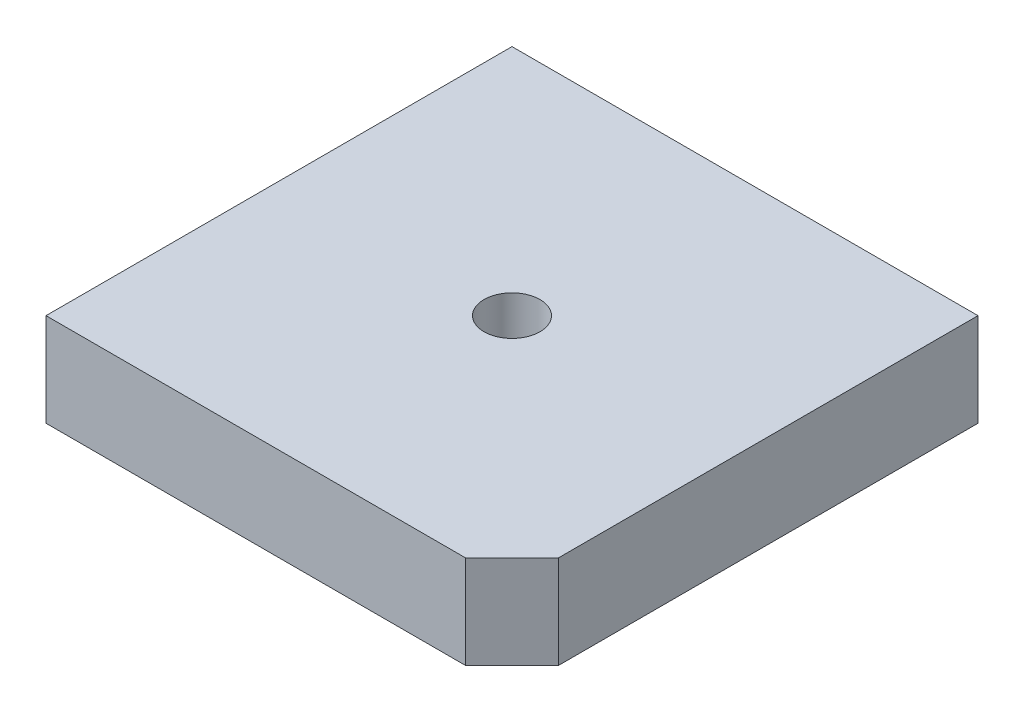
ISO-10303-21;
HEADER;
FILE_DESCRIPTION(('STEP AP214'),'2;1');
FILE_NAME('part.step','',(''),(''),'','','');
FILE_SCHEMA(('AUTOMOTIVE_DESIGN { 1 0 10303 214 1 1 1 1 }'));
ENDSEC;
DATA;
#1=APPLICATION_CONTEXT('core data for automotive mechanical design processes');
#2=APPLICATION_PROTOCOL_DEFINITION('international standard','automotive_design',2000,#1);
#3=PRODUCT_CONTEXT('',#1,'mechanical');
#4=PRODUCT('Part','Part','',(#3));
#5=PRODUCT_RELATED_PRODUCT_CATEGORY('part','',(#4));
#6=PRODUCT_DEFINITION_FORMATION('','',#4);
#7=PRODUCT_DEFINITION_CONTEXT('part definition',#1,'design');
#8=PRODUCT_DEFINITION('design','',#6,#7);
#9=PRODUCT_DEFINITION_SHAPE('','',#8);
#10=(LENGTH_UNIT() NAMED_UNIT(*) SI_UNIT(.MILLI.,.METRE.));
#11=(NAMED_UNIT(*) PLANE_ANGLE_UNIT() SI_UNIT($,.RADIAN.));
#12=(NAMED_UNIT(*) SI_UNIT($,.STERADIAN.) SOLID_ANGLE_UNIT());
#13=UNCERTAINTY_MEASURE_WITH_UNIT(LENGTH_MEASURE(1.E-05),#10,'distance_accuracy_value','');
#14=(GEOMETRIC_REPRESENTATION_CONTEXT(3) GLOBAL_UNCERTAINTY_ASSIGNED_CONTEXT((#13)) GLOBAL_UNIT_ASSIGNED_CONTEXT((#10,
#11,#12)) REPRESENTATION_CONTEXT('',''));
#15=CARTESIAN_POINT('',(0.,0.,0.));
#16=DIRECTION('',(0.,0.,1.));
#17=DIRECTION('',(1.,0.,0.));
#18=AXIS2_PLACEMENT_3D('',#15,#16,#17);
#19=CARTESIAN_POINT('',(-1275.,600.,50.));
#20=DIRECTION('',(0.,1.,0.));
#21=DIRECTION('',(0.,0.,1.));
#22=AXIS2_PLACEMENT_3D('',#19,#20,#21);
#23=PLANE('',#22);
#24=CARTESIAN_POINT('',(1225.,600.,875.));
#25=DIRECTION('',(0.,1.,0.));
#26=DIRECTION('',(0.,0.,1.));
#27=AXIS2_PLACEMENT_3D('',#24,#25,#26);
#28=CIRCLE('',#27,6.00000000000012);
#29=CARTESIAN_POINT('',(1225.,600.,881.));
#30=VERTEX_POINT('',#29);
#31=EDGE_CURVE('E18',#30,#30,#28,.T.);
#32=ORIENTED_EDGE('',*,*,#31,.T.);
#33=EDGE_LOOP('',(#32));
#34=FACE_BOUND('',#33,.T.);
#35=DIRECTION('',(1.,0.,0.));
#36=VECTOR('',#35,1.);
#37=CARTESIAN_POINT('',(1175.,600.,925.));
#38=LINE('',#37,#36);
#39=CARTESIAN_POINT('',(1175.,600.,925.));
#40=VERTEX_POINT('',#39);
#41=CARTESIAN_POINT('',(1265.,600.,925.));
#42=VERTEX_POINT('',#41);
#43=EDGE_CURVE('E89',#40,#42,#38,.T.);
#44=ORIENTED_EDGE('',*,*,#43,.F.);
#45=DIRECTION('',(0.,0.,1.));
#46=VECTOR('',#45,1.);
#47=CARTESIAN_POINT('',(1175.,600.,825.));
#48=LINE('',#47,#46);
#49=CARTESIAN_POINT('',(1175.,600.,825.));
#50=VERTEX_POINT('',#49);
#51=EDGE_CURVE('E59',#50,#40,#48,.T.);
#52=ORIENTED_EDGE('',*,*,#51,.F.);
#53=DIRECTION('',(-1.,0.,0.));
#54=VECTOR('',#53,1.);
#55=CARTESIAN_POINT('',(1275.,600.,825.));
#56=LINE('',#55,#54);
#57=CARTESIAN_POINT('',(1275.,600.,825.));
#58=VERTEX_POINT('',#57);
#59=EDGE_CURVE('E61',#58,#50,#56,.T.);
#60=ORIENTED_EDGE('',*,*,#59,.F.);
#61=DIRECTION('',(0.,0.,-1.));
#62=VECTOR('',#61,1.);
#63=CARTESIAN_POINT('',(1275.,600.,915.));
#64=LINE('',#63,#62);
#65=CARTESIAN_POINT('',(1275.,600.,915.));
#66=VERTEX_POINT('',#65);
#67=EDGE_CURVE('E63',#66,#58,#64,.T.);
#68=ORIENTED_EDGE('',*,*,#67,.F.);
#69=DIRECTION('',(0.707106781186544,0.,-0.707106781186551));
#70=VECTOR('',#69,1.);
#71=CARTESIAN_POINT('',(1265.,600.,925.));
#72=LINE('',#71,#70);
#73=EDGE_CURVE('E91',#42,#66,#72,.T.);
#74=ORIENTED_EDGE('',*,*,#73,.F.);
#75=EDGE_LOOP('',(#44,#52,#60,#68,#74));
#76=FACE_BOUND('',#75,.T.);
#77=ADVANCED_FACE('F15',(#34,#76),#23,.F.);
#78=CARTESIAN_POINT('',(1275.,600.,915.));
#79=DIRECTION('',(1.,0.,0.));
#80=DIRECTION('',(0.,0.,-1.));
#81=AXIS2_PLACEMENT_3D('',#78,#79,#80);
#82=PLANE('',#81);
#83=ORIENTED_EDGE('',*,*,#67,.T.);
#84=DIRECTION('',(0.,1.,0.));
#85=VECTOR('',#84,1.);
#86=CARTESIAN_POINT('',(1275.,600.,825.));
#87=LINE('',#86,#85);
#88=CARTESIAN_POINT('',(1275.,620.,825.));
#89=VERTEX_POINT('',#88);
#90=EDGE_CURVE('E68',#89,#58,#87,.F.);
#91=ORIENTED_EDGE('',*,*,#90,.F.);
#92=DIRECTION('',(0.,0.,1.));
#93=VECTOR('',#92,1.);
#94=CARTESIAN_POINT('',(1275.,620.,0.));
#95=LINE('',#94,#93);
#96=CARTESIAN_POINT('',(1275.,620.,915.));
#97=VERTEX_POINT('',#96);
#98=EDGE_CURVE('E95',#97,#89,#95,.F.);
#99=ORIENTED_EDGE('',*,*,#98,.F.);
#100=DIRECTION('',(0.,1.,0.));
#101=VECTOR('',#100,1.);
#102=CARTESIAN_POINT('',(1275.,600.,915.));
#103=LINE('',#102,#101);
#104=EDGE_CURVE('E74',#66,#97,#103,.T.);
#105=ORIENTED_EDGE('',*,*,#104,.F.);
#106=EDGE_LOOP('',(#83,#91,#99,#105));
#107=FACE_BOUND('',#106,.T.);
#108=ADVANCED_FACE('F71',(#107),#82,.T.);
#109=CARTESIAN_POINT('',(1275.,600.,825.));
#110=DIRECTION('',(0.,0.,-1.));
#111=DIRECTION('',(-1.,0.,0.));
#112=AXIS2_PLACEMENT_3D('',#109,#110,#111);
#113=PLANE('',#112);
#114=DIRECTION('',(1.,0.,0.));
#115=VECTOR('',#114,1.);
#116=CARTESIAN_POINT('',(0.,620.,825.));
#117=LINE('',#116,#115);
#118=CARTESIAN_POINT('',(1175.,620.,825.));
#119=VERTEX_POINT('',#118);
#120=EDGE_CURVE('E79',#89,#119,#117,.F.);
#121=ORIENTED_EDGE('',*,*,#120,.F.);
#122=ORIENTED_EDGE('',*,*,#90,.T.);
#123=ORIENTED_EDGE('',*,*,#59,.T.);
#124=DIRECTION('',(0.,1.,0.));
#125=VECTOR('',#124,1.);
#126=CARTESIAN_POINT('',(1175.,600.,825.));
#127=LINE('',#126,#125);
#128=EDGE_CURVE('E82',#119,#50,#127,.F.);
#129=ORIENTED_EDGE('',*,*,#128,.F.);
#130=EDGE_LOOP('',(#121,#122,#123,#129));
#131=FACE_BOUND('',#130,.T.);
#132=ADVANCED_FACE('F77',(#131),#113,.T.);
#133=CARTESIAN_POINT('',(1175.,600.,825.));
#134=DIRECTION('',(-1.,0.,0.));
#135=DIRECTION('',(0.,0.,1.));
#136=AXIS2_PLACEMENT_3D('',#133,#134,#135);
#137=PLANE('',#136);
#138=DIRECTION('',(0.,0.,1.));
#139=VECTOR('',#138,1.);
#140=CARTESIAN_POINT('',(1175.,620.,0.));
#141=LINE('',#140,#139);
#142=CARTESIAN_POINT('',(1175.,620.,925.));
#143=VERTEX_POINT('',#142);
#144=EDGE_CURVE('E98',#119,#143,#141,.T.);
#145=ORIENTED_EDGE('',*,*,#144,.F.);
#146=ORIENTED_EDGE('',*,*,#128,.T.);
#147=ORIENTED_EDGE('',*,*,#51,.T.);
#148=DIRECTION('',(0.,1.,0.));
#149=VECTOR('',#148,1.);
#150=CARTESIAN_POINT('',(1175.,600.,925.));
#151=LINE('',#150,#149);
#152=EDGE_CURVE('E86',#143,#40,#151,.F.);
#153=ORIENTED_EDGE('',*,*,#152,.F.);
#154=EDGE_LOOP('',(#145,#146,#147,#153));
#155=FACE_BOUND('',#154,.T.);
#156=ADVANCED_FACE('F112',(#155),#137,.T.);
#157=CARTESIAN_POINT('',(1175.,600.,925.));
#158=DIRECTION('',(0.,0.,1.));
#159=DIRECTION('',(1.,0.,0.));
#160=AXIS2_PLACEMENT_3D('',#157,#158,#159);
#161=PLANE('',#160);
#162=ORIENTED_EDGE('',*,*,#43,.T.);
#163=DIRECTION('',(0.,1.,0.));
#164=VECTOR('',#163,1.);
#165=CARTESIAN_POINT('',(1265.,600.,925.));
#166=LINE('',#165,#164);
#167=CARTESIAN_POINT('',(1265.,620.,925.));
#168=VERTEX_POINT('',#167);
#169=EDGE_CURVE('E32',#168,#42,#166,.F.);
#170=ORIENTED_EDGE('',*,*,#169,.F.);
#171=DIRECTION('',(1.,0.,0.));
#172=VECTOR('',#171,1.);
#173=CARTESIAN_POINT('',(0.,620.,925.));
#174=LINE('',#173,#172);
#175=EDGE_CURVE('E101',#143,#168,#174,.T.);
#176=ORIENTED_EDGE('',*,*,#175,.F.);
#177=ORIENTED_EDGE('',*,*,#152,.T.);
#178=EDGE_LOOP('',(#162,#170,#176,#177));
#179=FACE_BOUND('',#178,.T.);
#180=ADVANCED_FACE('F109',(#179),#161,.T.);
#181=CARTESIAN_POINT('',(1265.,600.,925.));
#182=DIRECTION('',(0.707106781186551,0.,0.707106781186544));
#183=DIRECTION('',(0.707106781186544,0.,-0.707106781186551));
#184=AXIS2_PLACEMENT_3D('',#181,#182,#183);
#185=PLANE('',#184);
#186=DIRECTION('',(0.707106781186551,0.,-0.707106781186544));
#187=VECTOR('',#186,1.);
#188=CARTESIAN_POINT('',(1265.,620.,925.));
#189=LINE('',#188,#187);
#190=EDGE_CURVE('E24',#168,#97,#189,.T.);
#191=ORIENTED_EDGE('',*,*,#190,.F.);
#192=ORIENTED_EDGE('',*,*,#169,.T.);
#193=ORIENTED_EDGE('',*,*,#73,.T.);
#194=ORIENTED_EDGE('',*,*,#104,.T.);
#195=EDGE_LOOP('',(#191,#192,#193,#194));
#196=FACE_BOUND('',#195,.T.);
#197=ADVANCED_FACE('F108',(#196),#185,.T.);
#198=CARTESIAN_POINT('',(1225.,600.,875.));
#199=DIRECTION('',(0.,1.,0.));
#200=DIRECTION('',(0.,0.,1.));
#201=AXIS2_PLACEMENT_3D('',#198,#199,#200);
#202=CYLINDRICAL_SURFACE('',#201,6.00000000000012);
#203=ORIENTED_EDGE('',*,*,#31,.F.);
#204=EDGE_LOOP('',(#203));
#205=FACE_BOUND('',#204,.T.);
#206=CARTESIAN_POINT('',(1225.,620.,875.));
#207=DIRECTION('',(0.,1.,0.));
#208=DIRECTION('',(0.,0.,1.));
#209=AXIS2_PLACEMENT_3D('',#206,#207,#208);
#210=CIRCLE('',#209,6.00000000000012);
#211=CARTESIAN_POINT('',(1225.,620.,881.));
#212=VERTEX_POINT('',#211);
#213=EDGE_CURVE('E10',#212,#212,#210,.F.);
#214=ORIENTED_EDGE('',*,*,#213,.F.);
#215=EDGE_LOOP('',(#214));
#216=FACE_BOUND('',#215,.T.);
#217=ADVANCED_FACE('F123',(#205,#216),#202,.F.);
#218=CARTESIAN_POINT('',(0.,620.,0.));
#219=DIRECTION('',(0.,1.,0.));
#220=DIRECTION('',(0.,0.,1.));
#221=AXIS2_PLACEMENT_3D('',#218,#219,#220);
#222=PLANE('',#221);
#223=ORIENTED_EDGE('',*,*,#213,.T.);
#224=EDGE_LOOP('',(#223));
#225=FACE_BOUND('',#224,.T.);
#226=ORIENTED_EDGE('',*,*,#175,.T.);
#227=ORIENTED_EDGE('',*,*,#190,.T.);
#228=ORIENTED_EDGE('',*,*,#98,.T.);
#229=ORIENTED_EDGE('',*,*,#120,.T.);
#230=ORIENTED_EDGE('',*,*,#144,.T.);
#231=EDGE_LOOP('',(#226,#227,#228,#229,#230));
#232=FACE_BOUND('',#231,.T.);
#233=ADVANCED_FACE('F106',(#225,#232),#222,.T.);
#234=CLOSED_SHELL('',(#77,#108,#132,#156,#180,#197,#217,#233));
#235=MANIFOLD_SOLID_BREP('B1',#234);
#236=ADVANCED_BREP_SHAPE_REPRESENTATION('',(#18,#235),#14);
#237=SHAPE_DEFINITION_REPRESENTATION(#9,#236);
ENDSEC;
END-ISO-10303-21;
